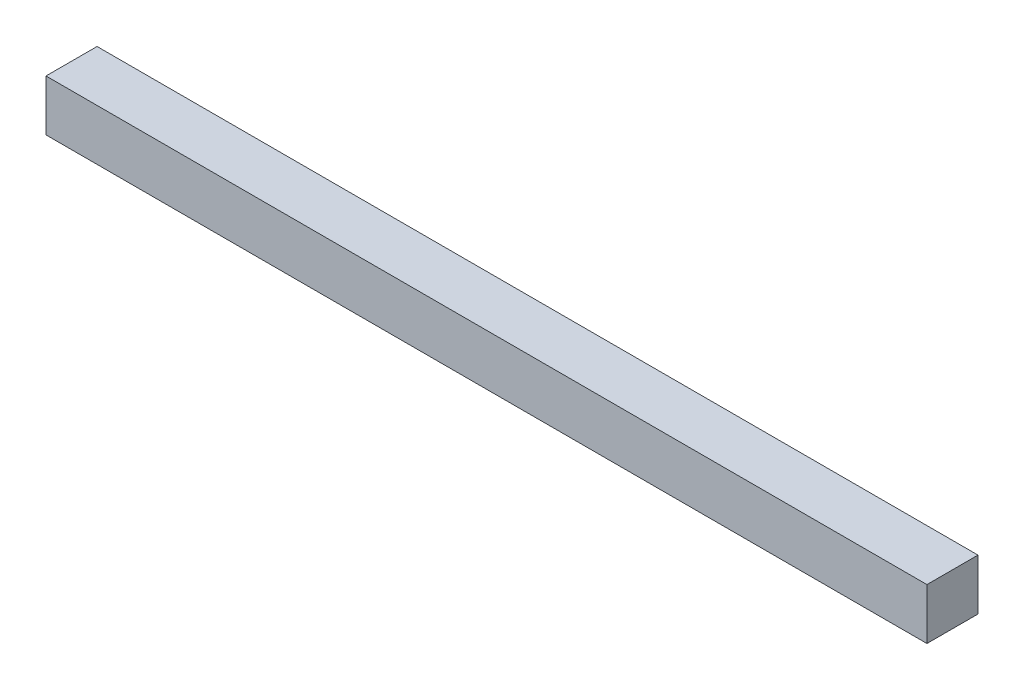
ISO-10303-21;
HEADER;
FILE_DESCRIPTION(('STEP AP214'),'2;1');
FILE_NAME('part.step','',(''),(''),'','','');
FILE_SCHEMA(('AUTOMOTIVE_DESIGN { 1 0 10303 214 1 1 1 1 }'));
ENDSEC;
DATA;
#1=APPLICATION_CONTEXT('core data for automotive mechanical design processes');
#2=APPLICATION_PROTOCOL_DEFINITION('international standard','automotive_design',2000,#1);
#3=PRODUCT_CONTEXT('',#1,'mechanical');
#4=PRODUCT('Part','Part','',(#3));
#5=PRODUCT_RELATED_PRODUCT_CATEGORY('part','',(#4));
#6=PRODUCT_DEFINITION_FORMATION('','',#4);
#7=PRODUCT_DEFINITION_CONTEXT('part definition',#1,'design');
#8=PRODUCT_DEFINITION('design','',#6,#7);
#9=PRODUCT_DEFINITION_SHAPE('','',#8);
#10=(LENGTH_UNIT() NAMED_UNIT(*) SI_UNIT(.MILLI.,.METRE.));
#11=(NAMED_UNIT(*) PLANE_ANGLE_UNIT() SI_UNIT($,.RADIAN.));
#12=(NAMED_UNIT(*) SI_UNIT($,.STERADIAN.) SOLID_ANGLE_UNIT());
#13=UNCERTAINTY_MEASURE_WITH_UNIT(LENGTH_MEASURE(1.E-05),#10,'distance_accuracy_value','');
#14=(GEOMETRIC_REPRESENTATION_CONTEXT(3) GLOBAL_UNCERTAINTY_ASSIGNED_CONTEXT((#13)) GLOBAL_UNIT_ASSIGNED_CONTEXT((#10,
#11,#12)) REPRESENTATION_CONTEXT('',''));
#15=CARTESIAN_POINT('',(0.,0.,0.));
#16=DIRECTION('',(0.,0.,1.));
#17=DIRECTION('',(1.,0.,0.));
#18=AXIS2_PLACEMENT_3D('',#15,#16,#17);
#19=CARTESIAN_POINT('',(690.,20.,20.));
#20=DIRECTION('',(0.,0.,-1.));
#21=DIRECTION('',(0.,1.,0.));
#22=AXIS2_PLACEMENT_3D('',#19,#20,#21);
#23=PLANE('',#22);
#24=DIRECTION('',(0.,-1.,0.));
#25=VECTOR('',#24,1.);
#26=CARTESIAN_POINT('',(0.,20.,20.));
#27=LINE('',#26,#25);
#28=CARTESIAN_POINT('',(0.,20.,20.));
#29=VERTEX_POINT('',#28);
#30=CARTESIAN_POINT('',(0.,-20.,20.));
#31=VERTEX_POINT('',#30);
#32=EDGE_CURVE('E107',#29,#31,#27,.T.);
#33=ORIENTED_EDGE('',*,*,#32,.T.);
#34=DIRECTION('',(-1.,0.,0.));
#35=VECTOR('',#34,1.);
#36=CARTESIAN_POINT('',(690.,-20.,20.));
#37=LINE('',#36,#35);
#38=CARTESIAN_POINT('',(690.,-20.,20.));
#39=VERTEX_POINT('',#38);
#40=EDGE_CURVE('E11',#39,#31,#37,.T.);
#41=ORIENTED_EDGE('',*,*,#40,.F.);
#42=DIRECTION('',(0.,-1.,0.));
#43=VECTOR('',#42,1.);
#44=CARTESIAN_POINT('',(690.,20.,20.));
#45=LINE('',#44,#43);
#46=CARTESIAN_POINT('',(690.,20.,20.));
#47=VERTEX_POINT('',#46);
#48=EDGE_CURVE('E91',#47,#39,#45,.T.);
#49=ORIENTED_EDGE('',*,*,#48,.F.);
#50=DIRECTION('',(-1.,0.,0.));
#51=VECTOR('',#50,1.);
#52=CARTESIAN_POINT('',(690.,20.,20.));
#53=LINE('',#52,#51);
#54=EDGE_CURVE('E103',#47,#29,#53,.T.);
#55=ORIENTED_EDGE('',*,*,#54,.T.);
#56=EDGE_LOOP('',(#33,#41,#49,#55));
#57=FACE_BOUND('',#56,.T.);
#58=ADVANCED_FACE('F39',(#57),#23,.F.);
#59=CARTESIAN_POINT('',(690.,-20.,20.));
#60=DIRECTION('',(0.,1.,0.));
#61=DIRECTION('',(0.,0.,1.));
#62=AXIS2_PLACEMENT_3D('',#59,#60,#61);
#63=PLANE('',#62);
#64=DIRECTION('',(0.,0.,-1.));
#65=VECTOR('',#64,1.);
#66=CARTESIAN_POINT('',(0.,-20.,20.));
#67=LINE('',#66,#65);
#68=CARTESIAN_POINT('',(0.,-20.,-20.));
#69=VERTEX_POINT('',#68);
#70=EDGE_CURVE('E96',#31,#69,#67,.T.);
#71=ORIENTED_EDGE('',*,*,#70,.T.);
#72=DIRECTION('',(-1.,0.,0.));
#73=VECTOR('',#72,1.);
#74=CARTESIAN_POINT('',(690.,-20.,-20.));
#75=LINE('',#74,#73);
#76=CARTESIAN_POINT('',(690.,-20.,-20.));
#77=VERTEX_POINT('',#76);
#78=EDGE_CURVE('E48',#77,#69,#75,.T.);
#79=ORIENTED_EDGE('',*,*,#78,.F.);
#80=DIRECTION('',(0.,0.,-1.));
#81=VECTOR('',#80,1.);
#82=CARTESIAN_POINT('',(690.,-20.,20.));
#83=LINE('',#82,#81);
#84=EDGE_CURVE('E86',#39,#77,#83,.T.);
#85=ORIENTED_EDGE('',*,*,#84,.F.);
#86=ORIENTED_EDGE('',*,*,#40,.T.);
#87=EDGE_LOOP('',(#71,#79,#85,#86));
#88=FACE_BOUND('',#87,.T.);
#89=ADVANCED_FACE('F95',(#88),#63,.F.);
#90=CARTESIAN_POINT('',(690.,20.,-20.));
#91=DIRECTION('',(0.,0.,1.));
#92=DIRECTION('',(0.,-1.,0.));
#93=AXIS2_PLACEMENT_3D('',#90,#91,#92);
#94=PLANE('',#93);
#95=DIRECTION('',(0.,1.,0.));
#96=VECTOR('',#95,1.);
#97=CARTESIAN_POINT('',(0.,20.,-20.));
#98=LINE('',#97,#96);
#99=CARTESIAN_POINT('',(0.,20.,-20.));
#100=VERTEX_POINT('',#99);
#101=EDGE_CURVE('E73',#69,#100,#98,.T.);
#102=ORIENTED_EDGE('',*,*,#101,.T.);
#103=DIRECTION('',(-1.,0.,0.));
#104=VECTOR('',#103,1.);
#105=CARTESIAN_POINT('',(690.,20.,-20.));
#106=LINE('',#105,#104);
#107=CARTESIAN_POINT('',(690.,20.,-20.));
#108=VERTEX_POINT('',#107);
#109=EDGE_CURVE('E98',#108,#100,#106,.T.);
#110=ORIENTED_EDGE('',*,*,#109,.F.);
#111=DIRECTION('',(0.,1.,0.));
#112=VECTOR('',#111,1.);
#113=CARTESIAN_POINT('',(690.,20.,-20.));
#114=LINE('',#113,#112);
#115=EDGE_CURVE('E89',#77,#108,#114,.T.);
#116=ORIENTED_EDGE('',*,*,#115,.F.);
#117=ORIENTED_EDGE('',*,*,#78,.T.);
#118=EDGE_LOOP('',(#102,#110,#116,#117));
#119=FACE_BOUND('',#118,.T.);
#120=ADVANCED_FACE('F99',(#119),#94,.F.);
#121=CARTESIAN_POINT('',(690.,20.,20.));
#122=DIRECTION('',(0.,-1.,0.));
#123=DIRECTION('',(0.,0.,-1.));
#124=AXIS2_PLACEMENT_3D('',#121,#122,#123);
#125=PLANE('',#124);
#126=DIRECTION('',(0.,0.,1.));
#127=VECTOR('',#126,1.);
#128=CARTESIAN_POINT('',(0.,20.,20.));
#129=LINE('',#128,#127);
#130=EDGE_CURVE('E79',#100,#29,#129,.T.);
#131=ORIENTED_EDGE('',*,*,#130,.T.);
#132=ORIENTED_EDGE('',*,*,#54,.F.);
#133=DIRECTION('',(0.,0.,1.));
#134=VECTOR('',#133,1.);
#135=CARTESIAN_POINT('',(690.,20.,20.));
#136=LINE('',#135,#134);
#137=EDGE_CURVE('E56',#108,#47,#136,.T.);
#138=ORIENTED_EDGE('',*,*,#137,.F.);
#139=ORIENTED_EDGE('',*,*,#109,.T.);
#140=EDGE_LOOP('',(#131,#132,#138,#139));
#141=FACE_BOUND('',#140,.T.);
#142=ADVANCED_FACE('F120',(#141),#125,.F.);
#143=CARTESIAN_POINT('',(690.,0.,0.));
#144=DIRECTION('',(1.,0.,0.));
#145=DIRECTION('',(0.,0.,-1.));
#146=AXIS2_PLACEMENT_3D('',#143,#144,#145);
#147=PLANE('',#146);
#148=ORIENTED_EDGE('',*,*,#48,.T.);
#149=ORIENTED_EDGE('',*,*,#84,.T.);
#150=ORIENTED_EDGE('',*,*,#115,.T.);
#151=ORIENTED_EDGE('',*,*,#137,.T.);
#152=EDGE_LOOP('',(#148,#149,#150,#151));
#153=FACE_BOUND('',#152,.T.);
#154=ADVANCED_FACE('F87',(#153),#147,.T.);
#155=CARTESIAN_POINT('',(0.,0.,0.));
#156=DIRECTION('',(1.,0.,0.));
#157=DIRECTION('',(0.,0.,-1.));
#158=AXIS2_PLACEMENT_3D('',#155,#156,#157);
#159=PLANE('',#158);
#160=ORIENTED_EDGE('',*,*,#32,.F.);
#161=ORIENTED_EDGE('',*,*,#130,.F.);
#162=ORIENTED_EDGE('',*,*,#101,.F.);
#163=ORIENTED_EDGE('',*,*,#70,.F.);
#164=EDGE_LOOP('',(#160,#161,#162,#163));
#165=FACE_BOUND('',#164,.T.);
#166=ADVANCED_FACE('F123',(#165),#159,.F.);
#167=CLOSED_SHELL('',(#58,#89,#120,#142,#154,#166));
#168=MANIFOLD_SOLID_BREP('B2',#167);
#169=ADVANCED_BREP_SHAPE_REPRESENTATION('',(#18,#168),#14);
#170=SHAPE_DEFINITION_REPRESENTATION(#9,#169);
ENDSEC;
END-ISO-10303-21;
